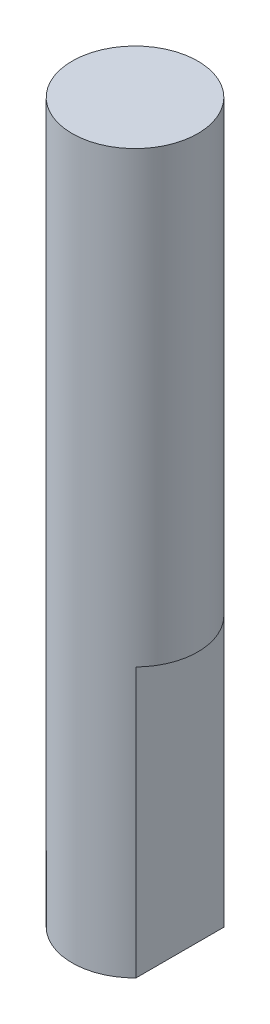
ISO-10303-21;
HEADER;
FILE_DESCRIPTION(('STEP AP214'),'2;1');
FILE_NAME('part.step','',(''),(''),'','','');
FILE_SCHEMA(('AUTOMOTIVE_DESIGN { 1 0 10303 214 1 1 1 1 }'));
ENDSEC;
DATA;
#1=APPLICATION_CONTEXT('core data for automotive mechanical design processes');
#2=APPLICATION_PROTOCOL_DEFINITION('international standard','automotive_design',2000,#1);
#3=PRODUCT_CONTEXT('',#1,'mechanical');
#4=PRODUCT('Part','Part','',(#3));
#5=PRODUCT_RELATED_PRODUCT_CATEGORY('part','',(#4));
#6=PRODUCT_DEFINITION_FORMATION('','',#4);
#7=PRODUCT_DEFINITION_CONTEXT('part definition',#1,'design');
#8=PRODUCT_DEFINITION('design','',#6,#7);
#9=PRODUCT_DEFINITION_SHAPE('','',#8);
#10=(LENGTH_UNIT() NAMED_UNIT(*) SI_UNIT(.MILLI.,.METRE.));
#11=(NAMED_UNIT(*) PLANE_ANGLE_UNIT() SI_UNIT($,.RADIAN.));
#12=(NAMED_UNIT(*) SI_UNIT($,.STERADIAN.) SOLID_ANGLE_UNIT());
#13=UNCERTAINTY_MEASURE_WITH_UNIT(LENGTH_MEASURE(1.E-05),#10,'distance_accuracy_value','');
#14=(GEOMETRIC_REPRESENTATION_CONTEXT(3) GLOBAL_UNCERTAINTY_ASSIGNED_CONTEXT((#13)) GLOBAL_UNIT_ASSIGNED_CONTEXT((#10,
#11,#12)) REPRESENTATION_CONTEXT('',''));
#15=CARTESIAN_POINT('',(0.,0.,0.));
#16=DIRECTION('',(0.,0.,1.));
#17=DIRECTION('',(1.,0.,0.));
#18=AXIS2_PLACEMENT_3D('',#15,#16,#17);
#19=CARTESIAN_POINT('',(0.,80.,0.));
#20=DIRECTION('',(0.,-1.,0.));
#21=DIRECTION('',(0.,0.,-1.));
#22=AXIS2_PLACEMENT_3D('',#19,#20,#21);
#23=CYLINDRICAL_SURFACE('',#22,7.);
#24=CARTESIAN_POINT('',(0.,80.,0.));
#25=DIRECTION('',(0.,1.,0.));
#26=DIRECTION('',(0.,0.,1.));
#27=AXIS2_PLACEMENT_3D('',#24,#25,#26);
#28=CIRCLE('',#27,7.);
#29=CARTESIAN_POINT('',(0.,80.,7.));
#30=VERTEX_POINT('',#29);
#31=EDGE_CURVE('E11',#30,#30,#28,.T.);
#32=ORIENTED_EDGE('',*,*,#31,.F.);
#33=EDGE_LOOP('',(#32));
#34=FACE_BOUND('',#33,.T.);
#35=CARTESIAN_POINT('',(0.,30.,0.));
#36=DIRECTION('',(0.,-1.,0.));
#37=DIRECTION('',(0.,0.,-1.));
#38=AXIS2_PLACEMENT_3D('',#35,#36,#37);
#39=CIRCLE('',#38,7.);
#40=CARTESIAN_POINT('',(-5.,30.,4.89897948556636));
#41=VERTEX_POINT('',#40);
#42=CARTESIAN_POINT('',(-5.,30.,-4.89897948556636));
#43=VERTEX_POINT('',#42);
#44=EDGE_CURVE('E83',#41,#43,#39,.T.);
#45=ORIENTED_EDGE('',*,*,#44,.F.);
#46=DIRECTION('',(0.,-1.,0.));
#47=VECTOR('',#46,1.);
#48=CARTESIAN_POINT('',(-5.,30.,4.89897948556636));
#49=LINE('',#48,#47);
#50=CARTESIAN_POINT('',(-5.,0.,4.89897948556636));
#51=VERTEX_POINT('',#50);
#52=EDGE_CURVE('E92',#41,#51,#49,.T.);
#53=ORIENTED_EDGE('',*,*,#52,.T.);
#54=CARTESIAN_POINT('',(0.,0.,0.));
#55=DIRECTION('',(0.,1.,0.));
#56=DIRECTION('',(0.,0.,1.));
#57=AXIS2_PLACEMENT_3D('',#54,#55,#56);
#58=CIRCLE('',#57,7.);
#59=CARTESIAN_POINT('',(5.,0.,4.89897948556636));
#60=VERTEX_POINT('',#59);
#61=EDGE_CURVE('E42',#51,#60,#58,.T.);
#62=ORIENTED_EDGE('',*,*,#61,.T.);
#63=DIRECTION('',(0.,-1.,0.));
#64=VECTOR('',#63,1.);
#65=CARTESIAN_POINT('',(5.,30.,4.89897948556636));
#66=LINE('',#65,#64);
#67=CARTESIAN_POINT('',(5.,30.,4.89897948556636));
#68=VERTEX_POINT('',#67);
#69=EDGE_CURVE('E63',#68,#60,#66,.T.);
#70=ORIENTED_EDGE('',*,*,#69,.F.);
#71=CARTESIAN_POINT('',(0.,30.,0.));
#72=DIRECTION('',(0.,-1.,0.));
#73=DIRECTION('',(0.,0.,-1.));
#74=AXIS2_PLACEMENT_3D('',#71,#72,#73);
#75=CIRCLE('',#74,7.);
#76=CARTESIAN_POINT('',(5.,30.,-4.89897948556636));
#77=VERTEX_POINT('',#76);
#78=EDGE_CURVE('E104',#77,#68,#75,.T.);
#79=ORIENTED_EDGE('',*,*,#78,.F.);
#80=DIRECTION('',(0.,-1.,0.));
#81=VECTOR('',#80,1.);
#82=CARTESIAN_POINT('',(5.,30.,-4.89897948556636));
#83=LINE('',#82,#81);
#84=CARTESIAN_POINT('',(5.,0.,-4.89897948556636));
#85=VERTEX_POINT('',#84);
#86=EDGE_CURVE('E114',#77,#85,#83,.T.);
#87=ORIENTED_EDGE('',*,*,#86,.T.);
#88=CARTESIAN_POINT('',(-5.,0.,-4.89897948556636));
#89=VERTEX_POINT('',#88);
#90=EDGE_CURVE('E48',#85,#89,#58,.T.);
#91=ORIENTED_EDGE('',*,*,#90,.T.);
#92=DIRECTION('',(0.,-1.,0.));
#93=VECTOR('',#92,1.);
#94=CARTESIAN_POINT('',(-5.,30.,-4.89897948556636));
#95=LINE('',#94,#93);
#96=EDGE_CURVE('E55',#43,#89,#95,.T.);
#97=ORIENTED_EDGE('',*,*,#96,.F.);
#98=EDGE_LOOP('',(#45,#53,#62,#70,#79,#87,#91,#97));
#99=FACE_BOUND('',#98,.T.);
#100=ADVANCED_FACE('F39',(#34,#99),#23,.T.);
#101=CARTESIAN_POINT('',(0.,80.,0.));
#102=DIRECTION('',(0.,1.,0.));
#103=DIRECTION('',(0.,0.,1.));
#104=AXIS2_PLACEMENT_3D('',#101,#102,#103);
#105=PLANE('',#104);
#106=ORIENTED_EDGE('',*,*,#31,.T.);
#107=EDGE_LOOP('',(#106));
#108=FACE_BOUND('',#107,.T.);
#109=ADVANCED_FACE('F138',(#108),#105,.T.);
#110=CARTESIAN_POINT('',(0.,0.,0.));
#111=DIRECTION('',(0.,1.,0.));
#112=DIRECTION('',(0.,0.,1.));
#113=AXIS2_PLACEMENT_3D('',#110,#111,#112);
#114=PLANE('',#113);
#115=ORIENTED_EDGE('',*,*,#61,.F.);
#116=DIRECTION('',(0.,0.,1.));
#117=VECTOR('',#116,1.);
#118=CARTESIAN_POINT('',(-5.,0.,4.89897948556636));
#119=LINE('',#118,#117);
#120=EDGE_CURVE('E89',#89,#51,#119,.T.);
#121=ORIENTED_EDGE('',*,*,#120,.F.);
#122=ORIENTED_EDGE('',*,*,#90,.F.);
#123=DIRECTION('',(0.,0.,-1.));
#124=VECTOR('',#123,1.);
#125=CARTESIAN_POINT('',(5.,0.,4.89897948556636));
#126=LINE('',#125,#124);
#127=EDGE_CURVE('E108',#60,#85,#126,.T.);
#128=ORIENTED_EDGE('',*,*,#127,.F.);
#129=EDGE_LOOP('',(#115,#121,#122,#128));
#130=FACE_BOUND('',#129,.T.);
#131=ADVANCED_FACE('F122',(#130),#114,.F.);
#132=CARTESIAN_POINT('',(5.,30.,4.89897948556636));
#133=DIRECTION('',(-1.,0.,0.));
#134=DIRECTION('',(0.,0.,1.));
#135=AXIS2_PLACEMENT_3D('',#132,#133,#134);
#136=PLANE('',#135);
#137=ORIENTED_EDGE('',*,*,#127,.T.);
#138=ORIENTED_EDGE('',*,*,#86,.F.);
#139=DIRECTION('',(0.,0.,-1.));
#140=VECTOR('',#139,1.);
#141=CARTESIAN_POINT('',(5.,30.,4.89897948556636));
#142=LINE('',#141,#140);
#143=EDGE_CURVE('E107',#68,#77,#142,.T.);
#144=ORIENTED_EDGE('',*,*,#143,.F.);
#145=ORIENTED_EDGE('',*,*,#69,.T.);
#146=EDGE_LOOP('',(#137,#138,#144,#145));
#147=FACE_BOUND('',#146,.T.);
#148=ADVANCED_FACE('F125',(#147),#136,.F.);
#149=CARTESIAN_POINT('',(0.,30.,0.));
#150=DIRECTION('',(0.,-1.,0.));
#151=DIRECTION('',(0.,0.,-1.));
#152=AXIS2_PLACEMENT_3D('',#149,#150,#151);
#153=PLANE('',#152);
#154=ORIENTED_EDGE('',*,*,#78,.T.);
#155=ORIENTED_EDGE('',*,*,#143,.T.);
#156=EDGE_LOOP('',(#154,#155));
#157=FACE_BOUND('',#156,.T.);
#158=ADVANCED_FACE('F128',(#157),#153,.T.);
#159=CARTESIAN_POINT('',(-5.,30.,4.89897948556636));
#160=DIRECTION('',(1.,0.,0.));
#161=DIRECTION('',(0.,0.,-1.));
#162=AXIS2_PLACEMENT_3D('',#159,#160,#161);
#163=PLANE('',#162);
#164=ORIENTED_EDGE('',*,*,#120,.T.);
#165=ORIENTED_EDGE('',*,*,#52,.F.);
#166=DIRECTION('',(0.,0.,1.));
#167=VECTOR('',#166,1.);
#168=CARTESIAN_POINT('',(-5.,30.,4.89897948556636));
#169=LINE('',#168,#167);
#170=EDGE_CURVE('E85',#43,#41,#169,.T.);
#171=ORIENTED_EDGE('',*,*,#170,.F.);
#172=ORIENTED_EDGE('',*,*,#96,.T.);
#173=EDGE_LOOP('',(#164,#165,#171,#172));
#174=FACE_BOUND('',#173,.T.);
#175=ADVANCED_FACE('F91',(#174),#163,.F.);
#176=CARTESIAN_POINT('',(0.,30.,0.));
#177=DIRECTION('',(0.,-1.,0.));
#178=DIRECTION('',(0.,0.,-1.));
#179=AXIS2_PLACEMENT_3D('',#176,#177,#178);
#180=PLANE('',#179);
#181=ORIENTED_EDGE('',*,*,#44,.T.);
#182=ORIENTED_EDGE('',*,*,#170,.T.);
#183=EDGE_LOOP('',(#181,#182));
#184=FACE_BOUND('',#183,.T.);
#185=ADVANCED_FACE('F84',(#184),#180,.T.);
#186=CLOSED_SHELL('',(#100,#109,#131,#148,#158,#175,#185));
#187=MANIFOLD_SOLID_BREP('B2',#186);
#188=ADVANCED_BREP_SHAPE_REPRESENTATION('',(#18,#187),#14);
#189=SHAPE_DEFINITION_REPRESENTATION(#9,#188);
ENDSEC;
END-ISO-10303-21;
